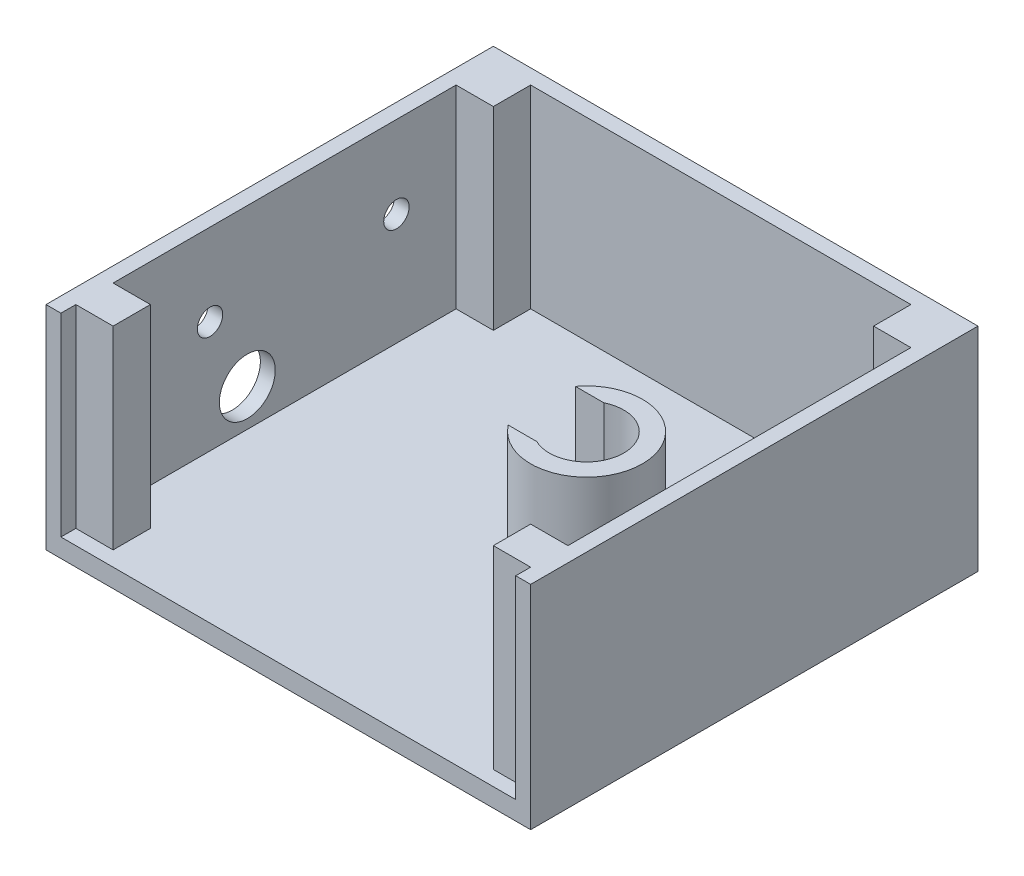
ISO-10303-21;
HEADER;
FILE_DESCRIPTION(('STEP AP214'),'2;1');
FILE_NAME('part.step','',(''),(''),'','','');
FILE_SCHEMA(('AUTOMOTIVE_DESIGN { 1 0 10303 214 1 1 1 1 }'));
ENDSEC;
DATA;
#1=APPLICATION_CONTEXT('core data for automotive mechanical design processes');
#2=APPLICATION_PROTOCOL_DEFINITION('international standard','automotive_design',2000,#1);
#3=PRODUCT_CONTEXT('',#1,'mechanical');
#4=PRODUCT('Part','Part','',(#3));
#5=PRODUCT_RELATED_PRODUCT_CATEGORY('part','',(#4));
#6=PRODUCT_DEFINITION_FORMATION('','',#4);
#7=PRODUCT_DEFINITION_CONTEXT('part definition',#1,'design');
#8=PRODUCT_DEFINITION('design','',#6,#7);
#9=PRODUCT_DEFINITION_SHAPE('','',#8);
#10=(LENGTH_UNIT() NAMED_UNIT(*) SI_UNIT(.MILLI.,.METRE.));
#11=(NAMED_UNIT(*) PLANE_ANGLE_UNIT() SI_UNIT($,.RADIAN.));
#12=(NAMED_UNIT(*) SI_UNIT($,.STERADIAN.) SOLID_ANGLE_UNIT());
#13=UNCERTAINTY_MEASURE_WITH_UNIT(LENGTH_MEASURE(1.E-05),#10,'distance_accuracy_value','');
#14=(GEOMETRIC_REPRESENTATION_CONTEXT(3) GLOBAL_UNCERTAINTY_ASSIGNED_CONTEXT((#13)) GLOBAL_UNIT_ASSIGNED_CONTEXT((#10,
#11,#12)) REPRESENTATION_CONTEXT('',''));
#15=CARTESIAN_POINT('',(0.,0.,0.));
#16=DIRECTION('',(0.,0.,1.));
#17=DIRECTION('',(1.,0.,0.));
#18=AXIS2_PLACEMENT_3D('',#15,#16,#17);
#19=CARTESIAN_POINT('',(15.,35.,-5.));
#20=DIRECTION('',(0.,-1.,0.));
#21=DIRECTION('',(0.,0.,-1.));
#22=AXIS2_PLACEMENT_3D('',#19,#20,#21);
#23=CYLINDRICAL_SURFACE('',#22,10.);
#24=DIRECTION('',(0.,-1.,0.));
#25=VECTOR('',#24,1.);
#26=CARTESIAN_POINT('',(10.6411010564593,35.,-14.));
#27=LINE('',#26,#25);
#28=CARTESIAN_POINT('',(10.6411010564593,5.,-14.));
#29=VERTEX_POINT('',#28);
#30=CARTESIAN_POINT('',(10.6411010564593,35.,-14.));
#31=VERTEX_POINT('',#30);
#32=EDGE_CURVE('E553',#29,#31,#27,.F.);
#33=ORIENTED_EDGE('',*,*,#32,.F.);
#34=CARTESIAN_POINT('',(15.,5.,-5.));
#35=DIRECTION('',(0.,1.,0.));
#36=DIRECTION('',(0.,0.,1.));
#37=AXIS2_PLACEMENT_3D('',#34,#35,#36);
#38=CIRCLE('',#37,10.);
#39=CARTESIAN_POINT('',(14.,5.,-14.9498743710662));
#40=VERTEX_POINT('',#39);
#41=EDGE_CURVE('E588',#40,#29,#38,.T.);
#42=ORIENTED_EDGE('',*,*,#41,.F.);
#43=DIRECTION('',(0.,-1.,0.));
#44=VECTOR('',#43,1.);
#45=CARTESIAN_POINT('',(14.,35.,-14.9498743710662));
#46=LINE('',#45,#44);
#47=CARTESIAN_POINT('',(14.,15.,-14.9498743710662));
#48=VERTEX_POINT('',#47);
#49=EDGE_CURVE('E69',#40,#48,#46,.F.);
#50=ORIENTED_EDGE('',*,*,#49,.T.);
#51=CARTESIAN_POINT('',(15.,15.,-5.));
#52=DIRECTION('',(0.,1.,0.));
#53=DIRECTION('',(0.,0.,1.));
#54=AXIS2_PLACEMENT_3D('',#51,#52,#53);
#55=CIRCLE('',#54,10.);
#56=CARTESIAN_POINT('',(16.,15.,-14.9498743710662));
#57=VERTEX_POINT('',#56);
#58=EDGE_CURVE('E266',#57,#48,#55,.T.);
#59=ORIENTED_EDGE('',*,*,#58,.F.);
#60=DIRECTION('',(0.,-1.,0.));
#61=VECTOR('',#60,1.);
#62=CARTESIAN_POINT('',(16.,35.,-14.9498743710662));
#63=LINE('',#62,#61);
#64=CARTESIAN_POINT('',(16.,5.,-14.9498743710662));
#65=VERTEX_POINT('',#64);
#66=EDGE_CURVE('E582',#57,#65,#63,.T.);
#67=ORIENTED_EDGE('',*,*,#66,.T.);
#68=CARTESIAN_POINT('',(16.,5.,4.9498743710662));
#69=VERTEX_POINT('',#68);
#70=EDGE_CURVE('E288',#69,#65,#38,.T.);
#71=ORIENTED_EDGE('',*,*,#70,.F.);
#72=DIRECTION('',(0.,-1.,0.));
#73=VECTOR('',#72,1.);
#74=CARTESIAN_POINT('',(16.,35.,4.9498743710662));
#75=LINE('',#74,#73);
#76=CARTESIAN_POINT('',(16.,15.,4.9498743710662));
#77=VERTEX_POINT('',#76);
#78=EDGE_CURVE('E577',#69,#77,#75,.F.);
#79=ORIENTED_EDGE('',*,*,#78,.T.);
#80=CARTESIAN_POINT('',(15.,15.,-5.));
#81=DIRECTION('',(0.,1.,0.));
#82=DIRECTION('',(0.,0.,1.));
#83=AXIS2_PLACEMENT_3D('',#80,#81,#82);
#84=CIRCLE('',#83,10.);
#85=CARTESIAN_POINT('',(14.,15.,4.9498743710662));
#86=VERTEX_POINT('',#85);
#87=EDGE_CURVE('E506',#86,#77,#84,.T.);
#88=ORIENTED_EDGE('',*,*,#87,.F.);
#89=DIRECTION('',(0.,-1.,0.));
#90=VECTOR('',#89,1.);
#91=CARTESIAN_POINT('',(14.,35.,4.9498743710662));
#92=LINE('',#91,#90);
#93=CARTESIAN_POINT('',(14.,5.,4.9498743710662));
#94=VERTEX_POINT('',#93);
#95=EDGE_CURVE('E547',#86,#94,#92,.T.);
#96=ORIENTED_EDGE('',*,*,#95,.T.);
#97=CARTESIAN_POINT('',(10.6411010564593,5.,4.));
#98=VERTEX_POINT('',#97);
#99=EDGE_CURVE('E584',#98,#94,#38,.T.);
#100=ORIENTED_EDGE('',*,*,#99,.F.);
#101=DIRECTION('',(0.,-1.,0.));
#102=VECTOR('',#101,1.);
#103=CARTESIAN_POINT('',(10.6411010564593,35.,4.));
#104=LINE('',#103,#102);
#105=CARTESIAN_POINT('',(10.6411010564593,35.,4.));
#106=VERTEX_POINT('',#105);
#107=EDGE_CURVE('E603',#106,#98,#104,.T.);
#108=ORIENTED_EDGE('',*,*,#107,.F.);
#109=CARTESIAN_POINT('',(15.,35.,-5.));
#110=DIRECTION('',(0.,1.,0.));
#111=DIRECTION('',(0.,0.,1.));
#112=AXIS2_PLACEMENT_3D('',#109,#110,#111);
#113=CIRCLE('',#112,10.);
#114=EDGE_CURVE('E274',#106,#31,#113,.T.);
#115=ORIENTED_EDGE('',*,*,#114,.T.);
#116=EDGE_LOOP('',(#33,#42,#50,#59,#67,#71,#79,#88,#96,#100,#108,#115));
#117=FACE_BOUND('',#116,.T.);
#118=ADVANCED_FACE('F45',(#117),#23,.F.);
#119=CARTESIAN_POINT('',(0.,5.,0.));
#120=DIRECTION('',(0.,-1.,0.));
#121=DIRECTION('',(0.,0.,-1.));
#122=AXIS2_PLACEMENT_3D('',#119,#120,#121);
#123=PLANE('',#122);
#124=DIRECTION('',(-1.,0.,0.));
#125=VECTOR('',#124,1.);
#126=CARTESIAN_POINT('',(-2.,5.,-14.));
#127=LINE('',#126,#125);
#128=CARTESIAN_POINT('',(3.,5.,-14.));
#129=VERTEX_POINT('',#128);
#130=EDGE_CURVE('E61',#29,#129,#127,.T.);
#131=ORIENTED_EDGE('',*,*,#130,.T.);
#132=CARTESIAN_POINT('',(15.,5.,-5.));
#133=DIRECTION('',(0.,-1.,0.));
#134=DIRECTION('',(0.,0.,-1.));
#135=AXIS2_PLACEMENT_3D('',#132,#133,#134);
#136=CIRCLE('',#135,15.);
#137=CARTESIAN_POINT('',(3.,5.,4.00000000000001));
#138=VERTEX_POINT('',#137);
#139=EDGE_CURVE('E487',#138,#129,#136,.F.);
#140=ORIENTED_EDGE('',*,*,#139,.F.);
#141=DIRECTION('',(1.,0.,0.));
#142=VECTOR('',#141,1.);
#143=CARTESIAN_POINT('',(13.,5.,4.));
#144=LINE('',#143,#142);
#145=EDGE_CURVE('E261',#138,#98,#144,.T.);
#146=ORIENTED_EDGE('',*,*,#145,.T.);
#147=ORIENTED_EDGE('',*,*,#99,.T.);
#148=DIRECTION('',(0.,0.,1.));
#149=VECTOR('',#148,1.);
#150=CARTESIAN_POINT('',(14.,5.,4.));
#151=LINE('',#150,#149);
#152=CARTESIAN_POINT('',(14.,5.,4.));
#153=VERTEX_POINT('',#152);
#154=EDGE_CURVE('E558',#153,#94,#151,.T.);
#155=ORIENTED_EDGE('',*,*,#154,.F.);
#156=CARTESIAN_POINT('',(15.,5.,4.));
#157=DIRECTION('',(0.,1.,0.));
#158=DIRECTION('',(0.,0.,1.));
#159=AXIS2_PLACEMENT_3D('',#156,#157,#158);
#160=CIRCLE('',#159,1.);
#161=CARTESIAN_POINT('',(16.,5.,4.));
#162=VERTEX_POINT('',#161);
#163=EDGE_CURVE('E540',#162,#153,#160,.T.);
#164=ORIENTED_EDGE('',*,*,#163,.F.);
#165=DIRECTION('',(0.,0.,-1.));
#166=VECTOR('',#165,1.);
#167=CARTESIAN_POINT('',(16.,5.,0.));
#168=LINE('',#167,#166);
#169=EDGE_CURVE('E498',#69,#162,#168,.T.);
#170=ORIENTED_EDGE('',*,*,#169,.F.);
#171=ORIENTED_EDGE('',*,*,#70,.T.);
#172=DIRECTION('',(0.,0.,-1.));
#173=VECTOR('',#172,1.);
#174=CARTESIAN_POINT('',(16.,5.,-15.7615227814441));
#175=LINE('',#174,#173);
#176=CARTESIAN_POINT('',(16.,5.,-14.));
#177=VERTEX_POINT('',#176);
#178=EDGE_CURVE('E539',#177,#65,#175,.T.);
#179=ORIENTED_EDGE('',*,*,#178,.F.);
#180=CARTESIAN_POINT('',(15.,5.,-14.));
#181=DIRECTION('',(0.,1.,0.));
#182=DIRECTION('',(0.,0.,1.));
#183=AXIS2_PLACEMENT_3D('',#180,#181,#182);
#184=CIRCLE('',#183,1.);
#185=CARTESIAN_POINT('',(14.,5.,-14.));
#186=VERTEX_POINT('',#185);
#187=EDGE_CURVE('E535',#186,#177,#184,.T.);
#188=ORIENTED_EDGE('',*,*,#187,.F.);
#189=DIRECTION('',(0.,0.,1.));
#190=VECTOR('',#189,1.);
#191=CARTESIAN_POINT('',(14.,5.,0.));
#192=LINE('',#191,#190);
#193=EDGE_CURVE('E502',#40,#186,#192,.T.);
#194=ORIENTED_EDGE('',*,*,#193,.F.);
#195=ORIENTED_EDGE('',*,*,#41,.T.);
#196=EDGE_LOOP('',(#131,#140,#146,#147,#155,#164,#170,#171,#179,#188,#194,#195));
#197=FACE_BOUND('',#196,.T.);
#198=DIRECTION('',(1.,0.,0.));
#199=VECTOR('',#198,1.);
#200=CARTESIAN_POINT('',(-61.,5.,56.));
#201=LINE('',#200,#199);
#202=CARTESIAN_POINT('',(-61.,5.,56.));
#203=VERTEX_POINT('',#202);
#204=CARTESIAN_POINT('',(-51.,5.,56.));
#205=VERTEX_POINT('',#204);
#206=EDGE_CURVE('E325',#203,#205,#201,.T.);
#207=ORIENTED_EDGE('',*,*,#206,.F.);
#208=DIRECTION('',(0.,0.,-1.));
#209=VECTOR('',#208,1.);
#210=CARTESIAN_POINT('',(-61.,5.,-56.));
#211=LINE('',#210,#209);
#212=CARTESIAN_POINT('',(-61.,5.,60.));
#213=VERTEX_POINT('',#212);
#214=EDGE_CURVE('E445',#213,#203,#211,.T.);
#215=ORIENTED_EDGE('',*,*,#214,.F.);
#216=DIRECTION('',(-1.,0.,0.));
#217=VECTOR('',#216,1.);
#218=CARTESIAN_POINT('',(65.,5.,60.));
#219=LINE('',#218,#217);
#220=CARTESIAN_POINT('',(61.,5.,60.));
#221=VERTEX_POINT('',#220);
#222=EDGE_CURVE('E464',#221,#213,#219,.T.);
#223=ORIENTED_EDGE('',*,*,#222,.F.);
#224=DIRECTION('',(0.,0.,1.));
#225=VECTOR('',#224,1.);
#226=CARTESIAN_POINT('',(61.,5.,60.));
#227=LINE('',#226,#225);
#228=CARTESIAN_POINT('',(61.,5.,56.));
#229=VERTEX_POINT('',#228);
#230=EDGE_CURVE('E453',#229,#221,#227,.T.);
#231=ORIENTED_EDGE('',*,*,#230,.F.);
#232=DIRECTION('',(1.,0.,0.));
#233=VECTOR('',#232,1.);
#234=CARTESIAN_POINT('',(61.,5.,56.));
#235=LINE('',#234,#233);
#236=CARTESIAN_POINT('',(51.,5.,56.));
#237=VERTEX_POINT('',#236);
#238=EDGE_CURVE('E338',#237,#229,#235,.T.);
#239=ORIENTED_EDGE('',*,*,#238,.F.);
#240=DIRECTION('',(0.,0.,1.));
#241=VECTOR('',#240,1.);
#242=CARTESIAN_POINT('',(51.,5.,56.));
#243=LINE('',#242,#241);
#244=CARTESIAN_POINT('',(51.,5.,46.));
#245=VERTEX_POINT('',#244);
#246=EDGE_CURVE('E341',#245,#237,#243,.T.);
#247=ORIENTED_EDGE('',*,*,#246,.F.);
#248=DIRECTION('',(-1.,0.,0.));
#249=VECTOR('',#248,1.);
#250=CARTESIAN_POINT('',(51.,5.,46.));
#251=LINE('',#250,#249);
#252=CARTESIAN_POINT('',(61.,5.,46.));
#253=VERTEX_POINT('',#252);
#254=EDGE_CURVE('E300',#253,#245,#251,.T.);
#255=ORIENTED_EDGE('',*,*,#254,.F.);
#256=CARTESIAN_POINT('',(61.,5.,-46.));
#257=VERTEX_POINT('',#256);
#258=EDGE_CURVE('E415',#257,#253,#227,.T.);
#259=ORIENTED_EDGE('',*,*,#258,.F.);
#260=DIRECTION('',(1.,0.,0.));
#261=VECTOR('',#260,1.);
#262=CARTESIAN_POINT('',(51.,5.,-46.));
#263=LINE('',#262,#261);
#264=CARTESIAN_POINT('',(51.,5.,-46.));
#265=VERTEX_POINT('',#264);
#266=EDGE_CURVE('E309',#265,#257,#263,.T.);
#267=ORIENTED_EDGE('',*,*,#266,.F.);
#268=DIRECTION('',(0.,0.,1.));
#269=VECTOR('',#268,1.);
#270=CARTESIAN_POINT('',(51.,5.,-56.));
#271=LINE('',#270,#269);
#272=CARTESIAN_POINT('',(51.,5.,-56.));
#273=VERTEX_POINT('',#272);
#274=EDGE_CURVE('E312',#273,#265,#271,.T.);
#275=ORIENTED_EDGE('',*,*,#274,.F.);
#276=DIRECTION('',(1.,0.,0.));
#277=VECTOR('',#276,1.);
#278=CARTESIAN_POINT('',(61.,5.,-56.));
#279=LINE('',#278,#277);
#280=CARTESIAN_POINT('',(-51.,5.,-56.));
#281=VERTEX_POINT('',#280);
#282=EDGE_CURVE('E449',#281,#273,#279,.T.);
#283=ORIENTED_EDGE('',*,*,#282,.F.);
#284=DIRECTION('',(0.,0.,-1.));
#285=VECTOR('',#284,1.);
#286=CARTESIAN_POINT('',(-51.,5.,-46.));
#287=LINE('',#286,#285);
#288=CARTESIAN_POINT('',(-51.,5.,-46.));
#289=VERTEX_POINT('',#288);
#290=EDGE_CURVE('E391',#289,#281,#287,.T.);
#291=ORIENTED_EDGE('',*,*,#290,.F.);
#292=DIRECTION('',(1.,0.,0.));
#293=VECTOR('',#292,1.);
#294=CARTESIAN_POINT('',(-61.,5.,-46.));
#295=LINE('',#294,#293);
#296=CARTESIAN_POINT('',(-61.,5.,-46.));
#297=VERTEX_POINT('',#296);
#298=EDGE_CURVE('E316',#297,#289,#295,.T.);
#299=ORIENTED_EDGE('',*,*,#298,.F.);
#300=CARTESIAN_POINT('',(-61.,5.,46.));
#301=VERTEX_POINT('',#300);
#302=EDGE_CURVE('E409',#301,#297,#211,.T.);
#303=ORIENTED_EDGE('',*,*,#302,.F.);
#304=DIRECTION('',(-1.,0.,0.));
#305=VECTOR('',#304,1.);
#306=CARTESIAN_POINT('',(-51.,5.,46.));
#307=LINE('',#306,#305);
#308=CARTESIAN_POINT('',(-51.,5.,46.));
#309=VERTEX_POINT('',#308);
#310=EDGE_CURVE('E370',#309,#301,#307,.T.);
#311=ORIENTED_EDGE('',*,*,#310,.F.);
#312=DIRECTION('',(0.,0.,-1.));
#313=VECTOR('',#312,1.);
#314=CARTESIAN_POINT('',(-51.,5.,56.));
#315=LINE('',#314,#313);
#316=EDGE_CURVE('E373',#205,#309,#315,.T.);
#317=ORIENTED_EDGE('',*,*,#316,.F.);
#318=EDGE_LOOP('',(#207,#215,#223,#231,#239,#247,#255,#259,#267,#275,#283,#291,#299,#303,#311,#317));
#319=FACE_BOUND('',#318,.T.);
#320=ADVANCED_FACE('F592',(#197,#319),#123,.F.);
#321=CARTESIAN_POINT('',(-61.,57.,-56.));
#322=DIRECTION('',(-1.,0.,0.));
#323=DIRECTION('',(0.,0.,1.));
#324=AXIS2_PLACEMENT_3D('',#321,#322,#323);
#325=PLANE('',#324);
#326=DIRECTION('',(0.,-1.,0.));
#327=VECTOR('',#326,1.);
#328=CARTESIAN_POINT('',(-61.,57.,56.));
#329=LINE('',#328,#327);
#330=CARTESIAN_POINT('',(-61.,57.,56.));
#331=VERTEX_POINT('',#330);
#332=EDGE_CURVE('E295',#331,#203,#329,.T.);
#333=ORIENTED_EDGE('',*,*,#332,.F.);
#334=DIRECTION('',(0.,0.,-1.));
#335=VECTOR('',#334,1.);
#336=CARTESIAN_POINT('',(-61.,57.,-56.));
#337=LINE('',#336,#335);
#338=CARTESIAN_POINT('',(-61.,57.,60.));
#339=VERTEX_POINT('',#338);
#340=EDGE_CURVE('E416',#339,#331,#337,.T.);
#341=ORIENTED_EDGE('',*,*,#340,.F.);
#342=DIRECTION('',(0.,-1.,0.));
#343=VECTOR('',#342,1.);
#344=CARTESIAN_POINT('',(-61.,57.,60.));
#345=LINE('',#344,#343);
#346=EDGE_CURVE('E459',#339,#213,#345,.T.);
#347=ORIENTED_EDGE('',*,*,#346,.T.);
#348=ORIENTED_EDGE('',*,*,#214,.T.);
#349=EDGE_LOOP('',(#333,#341,#347,#348));
#350=FACE_BOUND('',#349,.T.);
#351=ADVANCED_FACE('F675',(#350),#325,.F.);
#352=CARTESIAN_POINT('',(-61.,35.,-30.));
#353=DIRECTION('',(-1.,0.,0.));
#354=DIRECTION('',(0.,0.,1.));
#355=AXIS2_PLACEMENT_3D('',#352,#353,#354);
#356=CIRCLE('',#355,3.41);
#357=CARTESIAN_POINT('',(-61.,35.,-26.59));
#358=VERTEX_POINT('',#357);
#359=EDGE_CURVE('E277',#358,#358,#356,.T.);
#360=ORIENTED_EDGE('',*,*,#359,.T.);
#361=EDGE_LOOP('',(#360));
#362=FACE_BOUND('',#361,.T.);
#363=CARTESIAN_POINT('',(-61.,35.,20.));
#364=DIRECTION('',(-1.,0.,0.));
#365=DIRECTION('',(0.,0.,1.));
#366=AXIS2_PLACEMENT_3D('',#363,#364,#365);
#367=CIRCLE('',#366,3.41);
#368=CARTESIAN_POINT('',(-61.,35.,23.41));
#369=VERTEX_POINT('',#368);
#370=EDGE_CURVE('E618',#369,#369,#367,.T.);
#371=ORIENTED_EDGE('',*,*,#370,.T.);
#372=EDGE_LOOP('',(#371));
#373=FACE_BOUND('',#372,.T.);
#374=CARTESIAN_POINT('',(-61.,15.,9.99999999999999));
#375=DIRECTION('',(-1.,0.,0.));
#376=DIRECTION('',(0.,0.,1.));
#377=AXIS2_PLACEMENT_3D('',#374,#375,#376);
#378=CIRCLE('',#377,7.5);
#379=CARTESIAN_POINT('',(-61.,15.,17.5));
#380=VERTEX_POINT('',#379);
#381=EDGE_CURVE('E286',#380,#380,#378,.T.);
#382=ORIENTED_EDGE('',*,*,#381,.T.);
#383=EDGE_LOOP('',(#382));
#384=FACE_BOUND('',#383,.T.);
#385=DIRECTION('',(0.,-1.,0.));
#386=VECTOR('',#385,1.);
#387=CARTESIAN_POINT('',(-61.,57.,46.));
#388=LINE('',#387,#386);
#389=CARTESIAN_POINT('',(-61.,57.,46.));
#390=VERTEX_POINT('',#389);
#391=EDGE_CURVE('E365',#390,#301,#388,.T.);
#392=ORIENTED_EDGE('',*,*,#391,.T.);
#393=ORIENTED_EDGE('',*,*,#302,.T.);
#394=DIRECTION('',(0.,-1.,0.));
#395=VECTOR('',#394,1.);
#396=CARTESIAN_POINT('',(-61.,57.,-46.));
#397=LINE('',#396,#395);
#398=CARTESIAN_POINT('',(-61.,57.,-46.));
#399=VERTEX_POINT('',#398);
#400=EDGE_CURVE('E406',#399,#297,#397,.T.);
#401=ORIENTED_EDGE('',*,*,#400,.F.);
#402=EDGE_CURVE('E414',#390,#399,#337,.T.);
#403=ORIENTED_EDGE('',*,*,#402,.F.);
#404=EDGE_LOOP('',(#392,#393,#401,#403));
#405=FACE_BOUND('',#404,.T.);
#406=ADVANCED_FACE('F738',(#362,#373,#384,#405),#325,.F.);
#407=CARTESIAN_POINT('',(61.,57.,-56.));
#408=DIRECTION('',(0.,0.,-1.));
#409=DIRECTION('',(-1.,0.,0.));
#410=AXIS2_PLACEMENT_3D('',#407,#408,#409);
#411=PLANE('',#410);
#412=DIRECTION('',(0.,-1.,0.));
#413=VECTOR('',#412,1.);
#414=CARTESIAN_POINT('',(51.,57.,-56.));
#415=LINE('',#414,#413);
#416=CARTESIAN_POINT('',(51.,57.,-56.));
#417=VERTEX_POINT('',#416);
#418=EDGE_CURVE('E296',#417,#273,#415,.T.);
#419=ORIENTED_EDGE('',*,*,#418,.F.);
#420=DIRECTION('',(1.,0.,0.));
#421=VECTOR('',#420,1.);
#422=CARTESIAN_POINT('',(61.,57.,-56.));
#423=LINE('',#422,#421);
#424=CARTESIAN_POINT('',(-51.,57.,-56.));
#425=VERTEX_POINT('',#424);
#426=EDGE_CURVE('E420',#425,#417,#423,.T.);
#427=ORIENTED_EDGE('',*,*,#426,.F.);
#428=DIRECTION('',(0.,-1.,0.));
#429=VECTOR('',#428,1.);
#430=CARTESIAN_POINT('',(-51.,57.,-56.));
#431=LINE('',#430,#429);
#432=EDGE_CURVE('E394',#425,#281,#431,.T.);
#433=ORIENTED_EDGE('',*,*,#432,.T.);
#434=ORIENTED_EDGE('',*,*,#282,.T.);
#435=EDGE_LOOP('',(#419,#427,#433,#434));
#436=FACE_BOUND('',#435,.T.);
#437=ADVANCED_FACE('F734',(#436),#411,.F.);
#438=CARTESIAN_POINT('',(61.,57.,60.));
#439=DIRECTION('',(1.,0.,0.));
#440=DIRECTION('',(0.,0.,-1.));
#441=AXIS2_PLACEMENT_3D('',#438,#439,#440);
#442=PLANE('',#441);
#443=DIRECTION('',(0.,-1.,0.));
#444=VECTOR('',#443,1.);
#445=CARTESIAN_POINT('',(61.,57.,46.));
#446=LINE('',#445,#444);
#447=CARTESIAN_POINT('',(61.,57.,46.));
#448=VERTEX_POINT('',#447);
#449=EDGE_CURVE('E321',#448,#253,#446,.T.);
#450=ORIENTED_EDGE('',*,*,#449,.F.);
#451=DIRECTION('',(0.,0.,1.));
#452=VECTOR('',#451,1.);
#453=CARTESIAN_POINT('',(61.,57.,60.));
#454=LINE('',#453,#452);
#455=CARTESIAN_POINT('',(61.,57.,-46.));
#456=VERTEX_POINT('',#455);
#457=EDGE_CURVE('E427',#456,#448,#454,.T.);
#458=ORIENTED_EDGE('',*,*,#457,.F.);
#459=DIRECTION('',(0.,-1.,0.));
#460=VECTOR('',#459,1.);
#461=CARTESIAN_POINT('',(61.,57.,-46.));
#462=LINE('',#461,#460);
#463=EDGE_CURVE('E304',#456,#257,#462,.T.);
#464=ORIENTED_EDGE('',*,*,#463,.T.);
#465=ORIENTED_EDGE('',*,*,#258,.T.);
#466=EDGE_LOOP('',(#450,#458,#464,#465));
#467=FACE_BOUND('',#466,.T.);
#468=ADVANCED_FACE('F731',(#467),#442,.F.);
#469=DIRECTION('',(0.,-1.,0.));
#470=VECTOR('',#469,1.);
#471=CARTESIAN_POINT('',(61.,57.,56.));
#472=LINE('',#471,#470);
#473=CARTESIAN_POINT('',(61.,57.,56.));
#474=VERTEX_POINT('',#473);
#475=EDGE_CURVE('E333',#474,#229,#472,.T.);
#476=ORIENTED_EDGE('',*,*,#475,.T.);
#477=ORIENTED_EDGE('',*,*,#230,.T.);
#478=DIRECTION('',(0.,-1.,0.));
#479=VECTOR('',#478,1.);
#480=CARTESIAN_POINT('',(61.,57.,60.));
#481=LINE('',#480,#479);
#482=CARTESIAN_POINT('',(61.,57.,60.));
#483=VERTEX_POINT('',#482);
#484=EDGE_CURVE('E444',#483,#221,#481,.T.);
#485=ORIENTED_EDGE('',*,*,#484,.F.);
#486=EDGE_CURVE('E424',#474,#483,#454,.T.);
#487=ORIENTED_EDGE('',*,*,#486,.F.);
#488=EDGE_LOOP('',(#476,#477,#485,#487));
#489=FACE_BOUND('',#488,.T.);
#490=ADVANCED_FACE('F667',(#489),#442,.F.);
#491=CARTESIAN_POINT('',(65.,5.,60.));
#492=DIRECTION('',(0.,0.,1.));
#493=DIRECTION('',(1.,0.,0.));
#494=AXIS2_PLACEMENT_3D('',#491,#492,#493);
#495=PLANE('',#494);
#496=DIRECTION('',(-1.,0.,0.));
#497=VECTOR('',#496,1.);
#498=CARTESIAN_POINT('',(65.,0.,60.));
#499=LINE('',#498,#497);
#500=CARTESIAN_POINT('',(65.,0.,60.));
#501=VERTEX_POINT('',#500);
#502=CARTESIAN_POINT('',(-65.,0.,60.));
#503=VERTEX_POINT('',#502);
#504=EDGE_CURVE('E463',#501,#503,#499,.T.);
#505=ORIENTED_EDGE('',*,*,#504,.F.);
#506=DIRECTION('',(0.,-1.,0.));
#507=VECTOR('',#506,1.);
#508=CARTESIAN_POINT('',(65.,5.,60.));
#509=LINE('',#508,#507);
#510=CARTESIAN_POINT('',(65.,57.,60.));
#511=VERTEX_POINT('',#510);
#512=EDGE_CURVE('E484',#511,#501,#509,.T.);
#513=ORIENTED_EDGE('',*,*,#512,.F.);
#514=DIRECTION('',(1.,0.,0.));
#515=VECTOR('',#514,1.);
#516=CARTESIAN_POINT('',(65.,57.,60.));
#517=LINE('',#516,#515);
#518=EDGE_CURVE('E428',#483,#511,#517,.T.);
#519=ORIENTED_EDGE('',*,*,#518,.F.);
#520=ORIENTED_EDGE('',*,*,#484,.T.);
#521=ORIENTED_EDGE('',*,*,#222,.T.);
#522=ORIENTED_EDGE('',*,*,#346,.F.);
#523=DIRECTION('',(1.,0.,0.));
#524=VECTOR('',#523,1.);
#525=CARTESIAN_POINT('',(-61.,57.,60.));
#526=LINE('',#525,#524);
#527=CARTESIAN_POINT('',(-65.,57.,60.));
#528=VERTEX_POINT('',#527);
#529=EDGE_CURVE('E410',#528,#339,#526,.T.);
#530=ORIENTED_EDGE('',*,*,#529,.F.);
#531=DIRECTION('',(0.,-1.,0.));
#532=VECTOR('',#531,1.);
#533=CARTESIAN_POINT('',(-65.,5.,60.));
#534=LINE('',#533,#532);
#535=EDGE_CURVE('E468',#528,#503,#534,.T.);
#536=ORIENTED_EDGE('',*,*,#535,.T.);
#537=EDGE_LOOP('',(#505,#513,#519,#520,#521,#522,#530,#536));
#538=FACE_BOUND('',#537,.T.);
#539=ADVANCED_FACE('F47',(#538),#495,.T.);
#540=CARTESIAN_POINT('',(65.,5.,-60.));
#541=DIRECTION('',(1.,0.,0.));
#542=DIRECTION('',(0.,0.,-1.));
#543=AXIS2_PLACEMENT_3D('',#540,#541,#542);
#544=PLANE('',#543);
#545=DIRECTION('',(0.,0.,1.));
#546=VECTOR('',#545,1.);
#547=CARTESIAN_POINT('',(65.,0.,-60.));
#548=LINE('',#547,#546);
#549=CARTESIAN_POINT('',(65.,0.,-60.));
#550=VERTEX_POINT('',#549);
#551=EDGE_CURVE('E469',#550,#501,#548,.T.);
#552=ORIENTED_EDGE('',*,*,#551,.F.);
#553=DIRECTION('',(0.,-1.,0.));
#554=VECTOR('',#553,1.);
#555=CARTESIAN_POINT('',(65.,5.,-60.));
#556=LINE('',#555,#554);
#557=CARTESIAN_POINT('',(65.,57.,-60.));
#558=VERTEX_POINT('',#557);
#559=EDGE_CURVE('E488',#558,#550,#556,.T.);
#560=ORIENTED_EDGE('',*,*,#559,.F.);
#561=DIRECTION('',(0.,0.,-1.));
#562=VECTOR('',#561,1.);
#563=CARTESIAN_POINT('',(65.,57.,-60.));
#564=LINE('',#563,#562);
#565=EDGE_CURVE('E432',#511,#558,#564,.T.);
#566=ORIENTED_EDGE('',*,*,#565,.F.);
#567=ORIENTED_EDGE('',*,*,#512,.T.);
#568=EDGE_LOOP('',(#552,#560,#566,#567));
#569=FACE_BOUND('',#568,.T.);
#570=ADVANCED_FACE('F659',(#569),#544,.T.);
#571=CARTESIAN_POINT('',(-65.,5.,-60.));
#572=DIRECTION('',(0.,0.,-1.));
#573=DIRECTION('',(-1.,0.,0.));
#574=AXIS2_PLACEMENT_3D('',#571,#572,#573);
#575=PLANE('',#574);
#576=DIRECTION('',(1.,0.,0.));
#577=VECTOR('',#576,1.);
#578=CARTESIAN_POINT('',(-65.,0.,-60.));
#579=LINE('',#578,#577);
#580=CARTESIAN_POINT('',(-65.,0.,-60.));
#581=VERTEX_POINT('',#580);
#582=EDGE_CURVE('E477',#581,#550,#579,.T.);
#583=ORIENTED_EDGE('',*,*,#582,.F.);
#584=DIRECTION('',(0.,-1.,0.));
#585=VECTOR('',#584,1.);
#586=CARTESIAN_POINT('',(-65.,5.,-60.));
#587=LINE('',#586,#585);
#588=CARTESIAN_POINT('',(-65.,57.,-60.));
#589=VERTEX_POINT('',#588);
#590=EDGE_CURVE('E491',#589,#581,#587,.T.);
#591=ORIENTED_EDGE('',*,*,#590,.F.);
#592=DIRECTION('',(-1.,0.,0.));
#593=VECTOR('',#592,1.);
#594=CARTESIAN_POINT('',(-65.,57.,-60.));
#595=LINE('',#594,#593);
#596=EDGE_CURVE('E436',#558,#589,#595,.T.);
#597=ORIENTED_EDGE('',*,*,#596,.F.);
#598=ORIENTED_EDGE('',*,*,#559,.T.);
#599=EDGE_LOOP('',(#583,#591,#597,#598));
#600=FACE_BOUND('',#599,.T.);
#601=ADVANCED_FACE('F638',(#600),#575,.T.);
#602=CARTESIAN_POINT('',(-65.,5.,60.));
#603=DIRECTION('',(-1.,0.,0.));
#604=DIRECTION('',(0.,0.,1.));
#605=AXIS2_PLACEMENT_3D('',#602,#603,#604);
#606=PLANE('',#605);
#607=CARTESIAN_POINT('',(-65.,35.,-30.));
#608=DIRECTION('',(-1.,0.,0.));
#609=DIRECTION('',(0.,0.,1.));
#610=AXIS2_PLACEMENT_3D('',#607,#608,#609);
#611=CIRCLE('',#610,3.41);
#612=CARTESIAN_POINT('',(-65.,35.,-26.59));
#613=VERTEX_POINT('',#612);
#614=EDGE_CURVE('E622',#613,#613,#611,.T.);
#615=ORIENTED_EDGE('',*,*,#614,.F.);
#616=EDGE_LOOP('',(#615));
#617=FACE_BOUND('',#616,.T.);
#618=CARTESIAN_POINT('',(-65.,35.,20.));
#619=DIRECTION('',(-1.,0.,0.));
#620=DIRECTION('',(0.,0.,1.));
#621=AXIS2_PLACEMENT_3D('',#618,#619,#620);
#622=CIRCLE('',#621,3.41);
#623=CARTESIAN_POINT('',(-65.,35.,23.41));
#624=VERTEX_POINT('',#623);
#625=EDGE_CURVE('E623',#624,#624,#622,.T.);
#626=ORIENTED_EDGE('',*,*,#625,.F.);
#627=EDGE_LOOP('',(#626));
#628=FACE_BOUND('',#627,.T.);
#629=CARTESIAN_POINT('',(-65.,15.,9.99999999999999));
#630=DIRECTION('',(-1.,0.,0.));
#631=DIRECTION('',(0.,0.,1.));
#632=AXIS2_PLACEMENT_3D('',#629,#630,#631);
#633=CIRCLE('',#632,7.5);
#634=CARTESIAN_POINT('',(-65.,15.,17.5));
#635=VERTEX_POINT('',#634);
#636=EDGE_CURVE('E281',#635,#635,#633,.T.);
#637=ORIENTED_EDGE('',*,*,#636,.F.);
#638=EDGE_LOOP('',(#637));
#639=FACE_BOUND('',#638,.T.);
#640=DIRECTION('',(0.,0.,-1.));
#641=VECTOR('',#640,1.);
#642=CARTESIAN_POINT('',(-65.,0.,60.));
#643=LINE('',#642,#641);
#644=EDGE_CURVE('E473',#503,#581,#643,.T.);
#645=ORIENTED_EDGE('',*,*,#644,.F.);
#646=ORIENTED_EDGE('',*,*,#535,.F.);
#647=DIRECTION('',(0.,0.,1.));
#648=VECTOR('',#647,1.);
#649=CARTESIAN_POINT('',(-65.,57.,60.));
#650=LINE('',#649,#648);
#651=EDGE_CURVE('E440',#589,#528,#650,.T.);
#652=ORIENTED_EDGE('',*,*,#651,.F.);
#653=ORIENTED_EDGE('',*,*,#590,.T.);
#654=EDGE_LOOP('',(#645,#646,#652,#653));
#655=FACE_BOUND('',#654,.T.);
#656=ADVANCED_FACE('F634',(#617,#628,#639,#655),#606,.T.);
#657=CARTESIAN_POINT('',(0.,0.,0.));
#658=DIRECTION('',(0.,-1.,0.));
#659=DIRECTION('',(0.,0.,-1.));
#660=AXIS2_PLACEMENT_3D('',#657,#658,#659);
#661=PLANE('',#660);
#662=ORIENTED_EDGE('',*,*,#504,.T.);
#663=ORIENTED_EDGE('',*,*,#644,.T.);
#664=ORIENTED_EDGE('',*,*,#582,.T.);
#665=ORIENTED_EDGE('',*,*,#551,.T.);
#666=EDGE_LOOP('',(#662,#663,#664,#665));
#667=FACE_BOUND('',#666,.T.);
#668=ADVANCED_FACE('F637',(#667),#661,.T.);
#669=CARTESIAN_POINT('',(0.,57.,0.));
#670=DIRECTION('',(0.,-1.,0.));
#671=DIRECTION('',(0.,0.,-1.));
#672=AXIS2_PLACEMENT_3D('',#669,#670,#671);
#673=PLANE('',#672);
#674=DIRECTION('',(1.,0.,0.));
#675=VECTOR('',#674,1.);
#676=CARTESIAN_POINT('',(51.,57.,-46.));
#677=LINE('',#676,#675);
#678=CARTESIAN_POINT('',(51.,57.,-46.));
#679=VERTEX_POINT('',#678);
#680=EDGE_CURVE('E308',#679,#456,#677,.T.);
#681=ORIENTED_EDGE('',*,*,#680,.T.);
#682=ORIENTED_EDGE('',*,*,#457,.T.);
#683=DIRECTION('',(-1.,0.,0.));
#684=VECTOR('',#683,1.);
#685=CARTESIAN_POINT('',(51.,57.,46.));
#686=LINE('',#685,#684);
#687=CARTESIAN_POINT('',(51.,57.,46.));
#688=VERTEX_POINT('',#687);
#689=EDGE_CURVE('E342',#448,#688,#686,.T.);
#690=ORIENTED_EDGE('',*,*,#689,.T.);
#691=DIRECTION('',(0.,0.,1.));
#692=VECTOR('',#691,1.);
#693=CARTESIAN_POINT('',(51.,57.,56.));
#694=LINE('',#693,#692);
#695=CARTESIAN_POINT('',(51.,57.,56.));
#696=VERTEX_POINT('',#695);
#697=EDGE_CURVE('E350',#688,#696,#694,.T.);
#698=ORIENTED_EDGE('',*,*,#697,.T.);
#699=DIRECTION('',(1.,0.,0.));
#700=VECTOR('',#699,1.);
#701=CARTESIAN_POINT('',(61.,57.,56.));
#702=LINE('',#701,#700);
#703=EDGE_CURVE('E337',#696,#474,#702,.T.);
#704=ORIENTED_EDGE('',*,*,#703,.T.);
#705=ORIENTED_EDGE('',*,*,#486,.T.);
#706=ORIENTED_EDGE('',*,*,#518,.T.);
#707=ORIENTED_EDGE('',*,*,#565,.T.);
#708=ORIENTED_EDGE('',*,*,#596,.T.);
#709=ORIENTED_EDGE('',*,*,#651,.T.);
#710=ORIENTED_EDGE('',*,*,#529,.T.);
#711=ORIENTED_EDGE('',*,*,#340,.T.);
#712=DIRECTION('',(1.,0.,0.));
#713=VECTOR('',#712,1.);
#714=CARTESIAN_POINT('',(-61.,57.,56.));
#715=LINE('',#714,#713);
#716=CARTESIAN_POINT('',(-51.,57.,56.));
#717=VERTEX_POINT('',#716);
#718=EDGE_CURVE('E374',#331,#717,#715,.T.);
#719=ORIENTED_EDGE('',*,*,#718,.T.);
#720=DIRECTION('',(0.,0.,-1.));
#721=VECTOR('',#720,1.);
#722=CARTESIAN_POINT('',(-51.,57.,56.));
#723=LINE('',#722,#721);
#724=CARTESIAN_POINT('',(-51.,57.,46.));
#725=VERTEX_POINT('',#724);
#726=EDGE_CURVE('E382',#717,#725,#723,.T.);
#727=ORIENTED_EDGE('',*,*,#726,.T.);
#728=DIRECTION('',(-1.,0.,0.));
#729=VECTOR('',#728,1.);
#730=CARTESIAN_POINT('',(-51.,57.,46.));
#731=LINE('',#730,#729);
#732=EDGE_CURVE('E369',#725,#390,#731,.T.);
#733=ORIENTED_EDGE('',*,*,#732,.T.);
#734=ORIENTED_EDGE('',*,*,#402,.T.);
#735=DIRECTION('',(1.,0.,0.));
#736=VECTOR('',#735,1.);
#737=CARTESIAN_POINT('',(-61.,57.,-46.));
#738=LINE('',#737,#736);
#739=CARTESIAN_POINT('',(-51.,57.,-46.));
#740=VERTEX_POINT('',#739);
#741=EDGE_CURVE('E387',#399,#740,#738,.T.);
#742=ORIENTED_EDGE('',*,*,#741,.T.);
#743=DIRECTION('',(0.,0.,-1.));
#744=VECTOR('',#743,1.);
#745=CARTESIAN_POINT('',(-51.,57.,-46.));
#746=LINE('',#745,#744);
#747=EDGE_CURVE('E390',#740,#425,#746,.T.);
#748=ORIENTED_EDGE('',*,*,#747,.T.);
#749=ORIENTED_EDGE('',*,*,#426,.T.);
#750=DIRECTION('',(0.,0.,1.));
#751=VECTOR('',#750,1.);
#752=CARTESIAN_POINT('',(51.,57.,-56.));
#753=LINE('',#752,#751);
#754=EDGE_CURVE('E313',#417,#679,#753,.T.);
#755=ORIENTED_EDGE('',*,*,#754,.T.);
#756=EDGE_LOOP('',(#681,#682,#690,#698,#704,#705,#706,#707,#708,#709,#710,#711,#719,#727,#733,
#734,#742,#748,#749,#755));
#757=FACE_BOUND('',#756,.T.);
#758=ADVANCED_FACE('F654',(#757),#673,.F.);
#759=CARTESIAN_POINT('',(-61.,57.,-46.));
#760=DIRECTION('',(0.,0.,-1.));
#761=DIRECTION('',(-1.,0.,0.));
#762=AXIS2_PLACEMENT_3D('',#759,#760,#761);
#763=PLANE('',#762);
#764=ORIENTED_EDGE('',*,*,#298,.T.);
#765=DIRECTION('',(0.,-1.,0.));
#766=VECTOR('',#765,1.);
#767=CARTESIAN_POINT('',(-51.,57.,-46.));
#768=LINE('',#767,#766);
#769=EDGE_CURVE('E402',#740,#289,#768,.T.);
#770=ORIENTED_EDGE('',*,*,#769,.F.);
#771=ORIENTED_EDGE('',*,*,#741,.F.);
#772=ORIENTED_EDGE('',*,*,#400,.T.);
#773=EDGE_LOOP('',(#764,#770,#771,#772));
#774=FACE_BOUND('',#773,.T.);
#775=ADVANCED_FACE('F724',(#774),#763,.F.);
#776=CARTESIAN_POINT('',(-51.,57.,-46.));
#777=DIRECTION('',(-1.,0.,0.));
#778=DIRECTION('',(0.,0.,1.));
#779=AXIS2_PLACEMENT_3D('',#776,#777,#778);
#780=PLANE('',#779);
#781=ORIENTED_EDGE('',*,*,#290,.T.);
#782=ORIENTED_EDGE('',*,*,#432,.F.);
#783=ORIENTED_EDGE('',*,*,#747,.F.);
#784=ORIENTED_EDGE('',*,*,#769,.T.);
#785=EDGE_LOOP('',(#781,#782,#783,#784));
#786=FACE_BOUND('',#785,.T.);
#787=ADVANCED_FACE('F694',(#786),#780,.F.);
#788=CARTESIAN_POINT('',(51.,57.,-56.));
#789=DIRECTION('',(1.,0.,0.));
#790=DIRECTION('',(0.,0.,-1.));
#791=AXIS2_PLACEMENT_3D('',#788,#789,#790);
#792=PLANE('',#791);
#793=ORIENTED_EDGE('',*,*,#274,.T.);
#794=DIRECTION('',(0.,-1.,0.));
#795=VECTOR('',#794,1.);
#796=CARTESIAN_POINT('',(51.,57.,-46.));
#797=LINE('',#796,#795);
#798=EDGE_CURVE('E299',#679,#265,#797,.T.);
#799=ORIENTED_EDGE('',*,*,#798,.F.);
#800=ORIENTED_EDGE('',*,*,#754,.F.);
#801=ORIENTED_EDGE('',*,*,#418,.T.);
#802=EDGE_LOOP('',(#793,#799,#800,#801));
#803=FACE_BOUND('',#802,.T.);
#804=ADVANCED_FACE('F690',(#803),#792,.F.);
#805=CARTESIAN_POINT('',(51.,57.,-46.));
#806=DIRECTION('',(0.,0.,-1.));
#807=DIRECTION('',(-1.,0.,0.));
#808=AXIS2_PLACEMENT_3D('',#805,#806,#807);
#809=PLANE('',#808);
#810=ORIENTED_EDGE('',*,*,#266,.T.);
#811=ORIENTED_EDGE('',*,*,#463,.F.);
#812=ORIENTED_EDGE('',*,*,#680,.F.);
#813=ORIENTED_EDGE('',*,*,#798,.T.);
#814=EDGE_LOOP('',(#810,#811,#812,#813));
#815=FACE_BOUND('',#814,.T.);
#816=ADVANCED_FACE('F693',(#815),#809,.F.);
#817=CARTESIAN_POINT('',(51.,57.,46.));
#818=DIRECTION('',(0.,0.,1.));
#819=DIRECTION('',(1.,0.,0.));
#820=AXIS2_PLACEMENT_3D('',#817,#818,#819);
#821=PLANE('',#820);
#822=ORIENTED_EDGE('',*,*,#254,.T.);
#823=DIRECTION('',(0.,-1.,0.));
#824=VECTOR('',#823,1.);
#825=CARTESIAN_POINT('',(51.,57.,46.));
#826=LINE('',#825,#824);
#827=EDGE_CURVE('E324',#688,#245,#826,.T.);
#828=ORIENTED_EDGE('',*,*,#827,.F.);
#829=ORIENTED_EDGE('',*,*,#689,.F.);
#830=ORIENTED_EDGE('',*,*,#449,.T.);
#831=EDGE_LOOP('',(#822,#828,#829,#830));
#832=FACE_BOUND('',#831,.T.);
#833=ADVANCED_FACE('F698',(#832),#821,.F.);
#834=CARTESIAN_POINT('',(51.,57.,56.));
#835=DIRECTION('',(1.,0.,0.));
#836=DIRECTION('',(0.,0.,-1.));
#837=AXIS2_PLACEMENT_3D('',#834,#835,#836);
#838=PLANE('',#837);
#839=ORIENTED_EDGE('',*,*,#246,.T.);
#840=DIRECTION('',(0.,-1.,0.));
#841=VECTOR('',#840,1.);
#842=CARTESIAN_POINT('',(51.,57.,56.));
#843=LINE('',#842,#841);
#844=EDGE_CURVE('E329',#696,#237,#843,.T.);
#845=ORIENTED_EDGE('',*,*,#844,.F.);
#846=ORIENTED_EDGE('',*,*,#697,.F.);
#847=ORIENTED_EDGE('',*,*,#827,.T.);
#848=EDGE_LOOP('',(#839,#845,#846,#847));
#849=FACE_BOUND('',#848,.T.);
#850=ADVANCED_FACE('F702',(#849),#838,.F.);
#851=CARTESIAN_POINT('',(61.,57.,56.));
#852=DIRECTION('',(0.,0.,-1.));
#853=DIRECTION('',(-1.,0.,0.));
#854=AXIS2_PLACEMENT_3D('',#851,#852,#853);
#855=PLANE('',#854);
#856=ORIENTED_EDGE('',*,*,#238,.T.);
#857=ORIENTED_EDGE('',*,*,#475,.F.);
#858=ORIENTED_EDGE('',*,*,#703,.F.);
#859=ORIENTED_EDGE('',*,*,#844,.T.);
#860=EDGE_LOOP('',(#856,#857,#858,#859));
#861=FACE_BOUND('',#860,.T.);
#862=ADVANCED_FACE('F706',(#861),#855,.F.);
#863=CARTESIAN_POINT('',(-61.,57.,56.));
#864=DIRECTION('',(0.,0.,-1.));
#865=DIRECTION('',(-1.,0.,0.));
#866=AXIS2_PLACEMENT_3D('',#863,#864,#865);
#867=PLANE('',#866);
#868=ORIENTED_EDGE('',*,*,#206,.T.);
#869=DIRECTION('',(0.,-1.,0.));
#870=VECTOR('',#869,1.);
#871=CARTESIAN_POINT('',(-51.,57.,56.));
#872=LINE('',#871,#870);
#873=EDGE_CURVE('E357',#717,#205,#872,.T.);
#874=ORIENTED_EDGE('',*,*,#873,.F.);
#875=ORIENTED_EDGE('',*,*,#718,.F.);
#876=ORIENTED_EDGE('',*,*,#332,.T.);
#877=EDGE_LOOP('',(#868,#874,#875,#876));
#878=FACE_BOUND('',#877,.T.);
#879=ADVANCED_FACE('F710',(#878),#867,.F.);
#880=CARTESIAN_POINT('',(-51.,57.,56.));
#881=DIRECTION('',(-1.,0.,0.));
#882=DIRECTION('',(0.,0.,1.));
#883=AXIS2_PLACEMENT_3D('',#880,#881,#882);
#884=PLANE('',#883);
#885=ORIENTED_EDGE('',*,*,#316,.T.);
#886=DIRECTION('',(0.,-1.,0.));
#887=VECTOR('',#886,1.);
#888=CARTESIAN_POINT('',(-51.,57.,46.));
#889=LINE('',#888,#887);
#890=EDGE_CURVE('E361',#725,#309,#889,.T.);
#891=ORIENTED_EDGE('',*,*,#890,.F.);
#892=ORIENTED_EDGE('',*,*,#726,.F.);
#893=ORIENTED_EDGE('',*,*,#873,.T.);
#894=EDGE_LOOP('',(#885,#891,#892,#893));
#895=FACE_BOUND('',#894,.T.);
#896=ADVANCED_FACE('F714',(#895),#884,.F.);
#897=CARTESIAN_POINT('',(-51.,57.,46.));
#898=DIRECTION('',(0.,0.,1.));
#899=DIRECTION('',(1.,0.,0.));
#900=AXIS2_PLACEMENT_3D('',#897,#898,#899);
#901=PLANE('',#900);
#902=ORIENTED_EDGE('',*,*,#310,.T.);
#903=ORIENTED_EDGE('',*,*,#391,.F.);
#904=ORIENTED_EDGE('',*,*,#732,.F.);
#905=ORIENTED_EDGE('',*,*,#890,.T.);
#906=EDGE_LOOP('',(#902,#903,#904,#905));
#907=FACE_BOUND('',#906,.T.);
#908=ADVANCED_FACE('F688',(#907),#901,.F.);
#909=CARTESIAN_POINT('',(-60.,15.,9.99999999999999));
#910=DIRECTION('',(-1.,0.,0.));
#911=DIRECTION('',(0.,0.,1.));
#912=AXIS2_PLACEMENT_3D('',#909,#910,#911);
#913=CYLINDRICAL_SURFACE('',#912,7.5);
#914=ORIENTED_EDGE('',*,*,#636,.T.);
#915=EDGE_LOOP('',(#914));
#916=FACE_BOUND('',#915,.T.);
#917=ORIENTED_EDGE('',*,*,#381,.F.);
#918=EDGE_LOOP('',(#917));
#919=FACE_BOUND('',#918,.T.);
#920=ADVANCED_FACE('F683',(#916,#919),#913,.F.);
#921=CARTESIAN_POINT('',(15.,35.,-5.));
#922=DIRECTION('',(0.,1.,0.));
#923=DIRECTION('',(0.,0.,1.));
#924=AXIS2_PLACEMENT_3D('',#921,#922,#923);
#925=PLANE('',#924);
#926=DIRECTION('',(-1.,0.,0.));
#927=VECTOR('',#926,1.);
#928=CARTESIAN_POINT('',(-2.,35.,-14.));
#929=LINE('',#928,#927);
#930=CARTESIAN_POINT('',(3.,35.,-14.));
#931=VERTEX_POINT('',#930);
#932=EDGE_CURVE('E276',#31,#931,#929,.T.);
#933=ORIENTED_EDGE('',*,*,#932,.F.);
#934=ORIENTED_EDGE('',*,*,#114,.F.);
#935=DIRECTION('',(1.,0.,0.));
#936=VECTOR('',#935,1.);
#937=CARTESIAN_POINT('',(13.,35.,4.));
#938=LINE('',#937,#936);
#939=CARTESIAN_POINT('',(3.,35.,4.00000000000001));
#940=VERTEX_POINT('',#939);
#941=EDGE_CURVE('E258',#940,#106,#938,.T.);
#942=ORIENTED_EDGE('',*,*,#941,.F.);
#943=CARTESIAN_POINT('',(15.,35.,-5.));
#944=DIRECTION('',(0.,1.,0.));
#945=DIRECTION('',(0.,0.,1.));
#946=AXIS2_PLACEMENT_3D('',#943,#944,#945);
#947=CIRCLE('',#946,15.);
#948=EDGE_CURVE('E272',#940,#931,#947,.T.);
#949=ORIENTED_EDGE('',*,*,#948,.T.);
#950=EDGE_LOOP('',(#933,#934,#942,#949));
#951=FACE_BOUND('',#950,.T.);
#952=ADVANCED_FACE('F271',(#951),#925,.T.);
#953=CARTESIAN_POINT('',(15.,35.,-5.));
#954=DIRECTION('',(0.,-1.,0.));
#955=DIRECTION('',(0.,0.,-1.));
#956=AXIS2_PLACEMENT_3D('',#953,#954,#955);
#957=CYLINDRICAL_SURFACE('',#956,15.);
#958=ORIENTED_EDGE('',*,*,#139,.T.);
#959=DIRECTION('',(0.,-1.,0.));
#960=VECTOR('',#959,1.);
#961=CARTESIAN_POINT('',(3.,35.,-14.));
#962=LINE('',#961,#960);
#963=EDGE_CURVE('E11',#129,#931,#962,.F.);
#964=ORIENTED_EDGE('',*,*,#963,.T.);
#965=ORIENTED_EDGE('',*,*,#948,.F.);
#966=DIRECTION('',(0.,-1.,0.));
#967=VECTOR('',#966,1.);
#968=CARTESIAN_POINT('',(3.,35.,4.00000000000001));
#969=LINE('',#968,#967);
#970=EDGE_CURVE('E54',#940,#138,#969,.T.);
#971=ORIENTED_EDGE('',*,*,#970,.T.);
#972=EDGE_LOOP('',(#958,#964,#965,#971));
#973=FACE_BOUND('',#972,.T.);
#974=ADVANCED_FACE('F279',(#973),#957,.T.);
#975=CARTESIAN_POINT('',(15.,15.,4.));
#976=DIRECTION('',(0.,1.,0.));
#977=DIRECTION('',(0.,0.,1.));
#978=AXIS2_PLACEMENT_3D('',#975,#976,#977);
#979=PLANE('',#978);
#980=DIRECTION('',(0.,0.,1.));
#981=VECTOR('',#980,1.);
#982=CARTESIAN_POINT('',(14.,15.,4.));
#983=LINE('',#982,#981);
#984=CARTESIAN_POINT('',(14.,15.,4.));
#985=VERTEX_POINT('',#984);
#986=EDGE_CURVE('E557',#985,#86,#983,.T.);
#987=ORIENTED_EDGE('',*,*,#986,.T.);
#988=ORIENTED_EDGE('',*,*,#87,.T.);
#989=DIRECTION('',(0.,0.,-1.));
#990=VECTOR('',#989,1.);
#991=CARTESIAN_POINT('',(16.,15.,5.59008418184494));
#992=LINE('',#991,#990);
#993=CARTESIAN_POINT('',(16.,15.,4.));
#994=VERTEX_POINT('',#993);
#995=EDGE_CURVE('E562',#77,#994,#992,.T.);
#996=ORIENTED_EDGE('',*,*,#995,.T.);
#997=CARTESIAN_POINT('',(15.,15.,4.));
#998=DIRECTION('',(0.,1.,0.));
#999=DIRECTION('',(0.,0.,1.));
#1000=AXIS2_PLACEMENT_3D('',#997,#998,#999);
#1001=CIRCLE('',#1000,1.);
#1002=EDGE_CURVE('E569',#994,#985,#1001,.T.);
#1003=ORIENTED_EDGE('',*,*,#1002,.T.);
#1004=EDGE_LOOP('',(#987,#988,#996,#1003));
#1005=FACE_BOUND('',#1004,.T.);
#1006=ADVANCED_FACE('F679',(#1005),#979,.T.);
#1007=CARTESIAN_POINT('',(16.,15.,5.59008418184494));
#1008=DIRECTION('',(-1.,0.,0.));
#1009=DIRECTION('',(0.,0.,1.));
#1010=AXIS2_PLACEMENT_3D('',#1007,#1008,#1009);
#1011=PLANE('',#1010);
#1012=ORIENTED_EDGE('',*,*,#78,.F.);
#1013=ORIENTED_EDGE('',*,*,#169,.T.);
#1014=DIRECTION('',(0.,-1.,0.));
#1015=VECTOR('',#1014,1.);
#1016=CARTESIAN_POINT('',(16.,15.,4.));
#1017=LINE('',#1016,#1015);
#1018=EDGE_CURVE('E548',#994,#162,#1017,.T.);
#1019=ORIENTED_EDGE('',*,*,#1018,.F.);
#1020=ORIENTED_EDGE('',*,*,#995,.F.);
#1021=EDGE_LOOP('',(#1012,#1013,#1019,#1020));
#1022=FACE_BOUND('',#1021,.T.);
#1023=ADVANCED_FACE('F908',(#1022),#1011,.F.);
#1024=CARTESIAN_POINT('',(15.,15.,4.));
#1025=DIRECTION('',(0.,-1.,0.));
#1026=DIRECTION('',(0.,0.,-1.));
#1027=AXIS2_PLACEMENT_3D('',#1024,#1025,#1026);
#1028=CYLINDRICAL_SURFACE('',#1027,1.);
#1029=ORIENTED_EDGE('',*,*,#163,.T.);
#1030=DIRECTION('',(0.,-1.,0.));
#1031=VECTOR('',#1030,1.);
#1032=CARTESIAN_POINT('',(14.,15.,4.));
#1033=LINE('',#1032,#1031);
#1034=EDGE_CURVE('E552',#985,#153,#1033,.T.);
#1035=ORIENTED_EDGE('',*,*,#1034,.F.);
#1036=ORIENTED_EDGE('',*,*,#1002,.F.);
#1037=ORIENTED_EDGE('',*,*,#1018,.T.);
#1038=EDGE_LOOP('',(#1029,#1035,#1036,#1037));
#1039=FACE_BOUND('',#1038,.T.);
#1040=ADVANCED_FACE('F916',(#1039),#1028,.T.);
#1041=CARTESIAN_POINT('',(14.,15.,4.));
#1042=DIRECTION('',(1.,0.,0.));
#1043=DIRECTION('',(0.,0.,-1.));
#1044=AXIS2_PLACEMENT_3D('',#1041,#1042,#1043);
#1045=PLANE('',#1044);
#1046=ORIENTED_EDGE('',*,*,#95,.F.);
#1047=ORIENTED_EDGE('',*,*,#986,.F.);
#1048=ORIENTED_EDGE('',*,*,#1034,.T.);
#1049=ORIENTED_EDGE('',*,*,#154,.T.);
#1050=EDGE_LOOP('',(#1046,#1047,#1048,#1049));
#1051=FACE_BOUND('',#1050,.T.);
#1052=ADVANCED_FACE('F925',(#1051),#1045,.F.);
#1053=CARTESIAN_POINT('',(15.,15.,-14.));
#1054=DIRECTION('',(0.,1.,0.));
#1055=DIRECTION('',(0.,0.,1.));
#1056=AXIS2_PLACEMENT_3D('',#1053,#1054,#1055);
#1057=PLANE('',#1056);
#1058=DIRECTION('',(0.,0.,-1.));
#1059=VECTOR('',#1058,1.);
#1060=CARTESIAN_POINT('',(16.,15.,-15.7615227814441));
#1061=LINE('',#1060,#1059);
#1062=CARTESIAN_POINT('',(16.,15.,-14.));
#1063=VERTEX_POINT('',#1062);
#1064=EDGE_CURVE('E518',#1063,#57,#1061,.T.);
#1065=ORIENTED_EDGE('',*,*,#1064,.T.);
#1066=ORIENTED_EDGE('',*,*,#58,.T.);
#1067=DIRECTION('',(0.,0.,1.));
#1068=VECTOR('',#1067,1.);
#1069=CARTESIAN_POINT('',(14.,15.,-14.));
#1070=LINE('',#1069,#1068);
#1071=CARTESIAN_POINT('',(14.,15.,-14.));
#1072=VERTEX_POINT('',#1071);
#1073=EDGE_CURVE('E516',#48,#1072,#1070,.T.);
#1074=ORIENTED_EDGE('',*,*,#1073,.T.);
#1075=CARTESIAN_POINT('',(15.,15.,-14.));
#1076=DIRECTION('',(0.,1.,0.));
#1077=DIRECTION('',(0.,0.,1.));
#1078=AXIS2_PLACEMENT_3D('',#1075,#1076,#1077);
#1079=CIRCLE('',#1078,1.);
#1080=EDGE_CURVE('E531',#1072,#1063,#1079,.T.);
#1081=ORIENTED_EDGE('',*,*,#1080,.T.);
#1082=EDGE_LOOP('',(#1065,#1066,#1074,#1081));
#1083=FACE_BOUND('',#1082,.T.);
#1084=ADVANCED_FACE('F514',(#1083),#1057,.T.);
#1085=CARTESIAN_POINT('',(15.,15.,-14.));
#1086=DIRECTION('',(0.,-1.,0.));
#1087=DIRECTION('',(0.,0.,-1.));
#1088=AXIS2_PLACEMENT_3D('',#1085,#1086,#1087);
#1089=CYLINDRICAL_SURFACE('',#1088,1.);
#1090=ORIENTED_EDGE('',*,*,#187,.T.);
#1091=DIRECTION('',(0.,-1.,0.));
#1092=VECTOR('',#1091,1.);
#1093=CARTESIAN_POINT('',(16.,15.,-14.));
#1094=LINE('',#1093,#1092);
#1095=EDGE_CURVE('E529',#1063,#177,#1094,.T.);
#1096=ORIENTED_EDGE('',*,*,#1095,.F.);
#1097=ORIENTED_EDGE('',*,*,#1080,.F.);
#1098=DIRECTION('',(0.,-1.,0.));
#1099=VECTOR('',#1098,1.);
#1100=CARTESIAN_POINT('',(14.,15.,-14.));
#1101=LINE('',#1100,#1099);
#1102=EDGE_CURVE('E523',#1072,#186,#1101,.T.);
#1103=ORIENTED_EDGE('',*,*,#1102,.T.);
#1104=EDGE_LOOP('',(#1090,#1096,#1097,#1103));
#1105=FACE_BOUND('',#1104,.T.);
#1106=ADVANCED_FACE('F599',(#1105),#1089,.T.);
#1107=CARTESIAN_POINT('',(16.,15.,-15.7615227814441));
#1108=DIRECTION('',(-1.,0.,0.));
#1109=DIRECTION('',(0.,0.,1.));
#1110=AXIS2_PLACEMENT_3D('',#1107,#1108,#1109);
#1111=PLANE('',#1110);
#1112=ORIENTED_EDGE('',*,*,#66,.F.);
#1113=ORIENTED_EDGE('',*,*,#1064,.F.);
#1114=ORIENTED_EDGE('',*,*,#1095,.T.);
#1115=ORIENTED_EDGE('',*,*,#178,.T.);
#1116=EDGE_LOOP('',(#1112,#1113,#1114,#1115));
#1117=FACE_BOUND('',#1116,.T.);
#1118=ADVANCED_FACE('F596',(#1117),#1111,.F.);
#1119=CARTESIAN_POINT('',(14.,15.,-14.));
#1120=DIRECTION('',(1.,0.,0.));
#1121=DIRECTION('',(0.,0.,-1.));
#1122=AXIS2_PLACEMENT_3D('',#1119,#1120,#1121);
#1123=PLANE('',#1122);
#1124=ORIENTED_EDGE('',*,*,#49,.F.);
#1125=ORIENTED_EDGE('',*,*,#193,.T.);
#1126=ORIENTED_EDGE('',*,*,#1102,.F.);
#1127=ORIENTED_EDGE('',*,*,#1073,.F.);
#1128=EDGE_LOOP('',(#1124,#1125,#1126,#1127));
#1129=FACE_BOUND('',#1128,.T.);
#1130=ADVANCED_FACE('F521',(#1129),#1123,.F.);
#1131=CARTESIAN_POINT('',(-2.,5.,-14.));
#1132=DIRECTION('',(0.,0.,-1.));
#1133=DIRECTION('',(-1.,0.,0.));
#1134=AXIS2_PLACEMENT_3D('',#1131,#1132,#1133);
#1135=PLANE('',#1134);
#1136=ORIENTED_EDGE('',*,*,#32,.T.);
#1137=ORIENTED_EDGE('',*,*,#932,.T.);
#1138=ORIENTED_EDGE('',*,*,#963,.F.);
#1139=ORIENTED_EDGE('',*,*,#130,.F.);
#1140=EDGE_LOOP('',(#1136,#1137,#1138,#1139));
#1141=FACE_BOUND('',#1140,.T.);
#1142=ADVANCED_FACE('F960',(#1141),#1135,.F.);
#1143=CARTESIAN_POINT('',(13.,5.,4.));
#1144=DIRECTION('',(0.,0.,1.));
#1145=DIRECTION('',(1.,0.,0.));
#1146=AXIS2_PLACEMENT_3D('',#1143,#1144,#1145);
#1147=PLANE('',#1146);
#1148=ORIENTED_EDGE('',*,*,#107,.T.);
#1149=ORIENTED_EDGE('',*,*,#145,.F.);
#1150=ORIENTED_EDGE('',*,*,#970,.F.);
#1151=ORIENTED_EDGE('',*,*,#941,.T.);
#1152=EDGE_LOOP('',(#1148,#1149,#1150,#1151));
#1153=FACE_BOUND('',#1152,.T.);
#1154=ADVANCED_FACE('F257',(#1153),#1147,.F.);
#1155=CARTESIAN_POINT('',(-60.,35.,20.));
#1156=DIRECTION('',(-1.,0.,0.));
#1157=DIRECTION('',(0.,0.,1.));
#1158=AXIS2_PLACEMENT_3D('',#1155,#1156,#1157);
#1159=CYLINDRICAL_SURFACE('',#1158,3.41);
#1160=ORIENTED_EDGE('',*,*,#625,.T.);
#1161=EDGE_LOOP('',(#1160));
#1162=FACE_BOUND('',#1161,.T.);
#1163=ORIENTED_EDGE('',*,*,#370,.F.);
#1164=EDGE_LOOP('',(#1163));
#1165=FACE_BOUND('',#1164,.T.);
#1166=ADVANCED_FACE('F973',(#1162,#1165),#1159,.F.);
#1167=CARTESIAN_POINT('',(-60.,35.,-30.));
#1168=DIRECTION('',(-1.,0.,0.));
#1169=DIRECTION('',(0.,0.,1.));
#1170=AXIS2_PLACEMENT_3D('',#1167,#1168,#1169);
#1171=CYLINDRICAL_SURFACE('',#1170,3.41);
#1172=ORIENTED_EDGE('',*,*,#614,.T.);
#1173=EDGE_LOOP('',(#1172));
#1174=FACE_BOUND('',#1173,.T.);
#1175=ORIENTED_EDGE('',*,*,#359,.F.);
#1176=EDGE_LOOP('',(#1175));
#1177=FACE_BOUND('',#1176,.T.);
#1178=ADVANCED_FACE('F631',(#1174,#1177),#1171,.F.);
#1179=CLOSED_SHELL('',(#118,#320,#351,#406,#437,#468,#490,#539,#570,#601,#656,#668,#758,#775,
#787,#804,#816,#833,#850,#862,#879,#896,#908,#920,#952,#974,#1006,#1023,#1040,#1052,#1084,#1106,
#1118,#1130,#1142,#1154,#1166,#1178));
#1180=MANIFOLD_SOLID_BREP('B2',#1179);
#1181=ADVANCED_BREP_SHAPE_REPRESENTATION('',(#18,#1180),#14);
#1182=SHAPE_DEFINITION_REPRESENTATION(#9,#1181);
ENDSEC;
END-ISO-10303-21;
